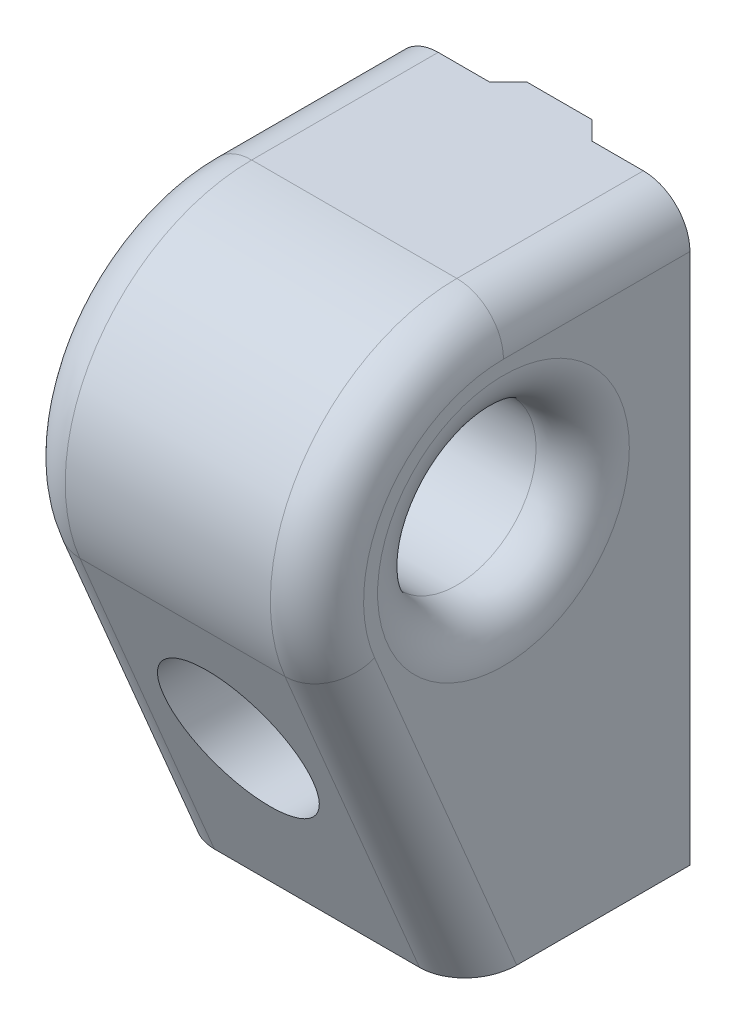
ISO-10303-21;
HEADER;
FILE_DESCRIPTION(('STEP AP214'),'2;1');
FILE_NAME('part.step','',(''),(''),'','','');
FILE_SCHEMA(('AUTOMOTIVE_DESIGN { 1 0 10303 214 1 1 1 1 }'));
ENDSEC;
DATA;
#1=APPLICATION_CONTEXT('core data for automotive mechanical design processes');
#2=APPLICATION_PROTOCOL_DEFINITION('international standard','automotive_design',2000,#1);
#3=PRODUCT_CONTEXT('',#1,'mechanical');
#4=PRODUCT('Part','Part','',(#3));
#5=PRODUCT_RELATED_PRODUCT_CATEGORY('part','',(#4));
#6=PRODUCT_DEFINITION_FORMATION('','',#4);
#7=PRODUCT_DEFINITION_CONTEXT('part definition',#1,'design');
#8=PRODUCT_DEFINITION('design','',#6,#7);
#9=PRODUCT_DEFINITION_SHAPE('','',#8);
#10=(LENGTH_UNIT() NAMED_UNIT(*) SI_UNIT(.MILLI.,.METRE.));
#11=(NAMED_UNIT(*) PLANE_ANGLE_UNIT() SI_UNIT($,.RADIAN.));
#12=(NAMED_UNIT(*) SI_UNIT($,.STERADIAN.) SOLID_ANGLE_UNIT());
#13=UNCERTAINTY_MEASURE_WITH_UNIT(LENGTH_MEASURE(1.E-05),#10,'distance_accuracy_value','');
#14=(GEOMETRIC_REPRESENTATION_CONTEXT(3) GLOBAL_UNCERTAINTY_ASSIGNED_CONTEXT((#13)) GLOBAL_UNIT_ASSIGNED_CONTEXT((#10,
#11,#12)) REPRESENTATION_CONTEXT('',''));
#15=CARTESIAN_POINT('',(0.,0.,0.));
#16=DIRECTION('',(0.,0.,1.));
#17=DIRECTION('',(1.,0.,0.));
#18=AXIS2_PLACEMENT_3D('',#15,#16,#17);
#19=CARTESIAN_POINT('',(0.,0.,-1.));
#20=DIRECTION('',(0.,0.,-1.));
#21=DIRECTION('',(-1.,0.,0.));
#22=AXIS2_PLACEMENT_3D('',#19,#20,#21);
#23=PLANE('',#22);
#24=CARTESIAN_POINT('',(0.,10.,-1.));
#25=DIRECTION('',(0.,0.,-1.));
#26=DIRECTION('',(-1.,0.,0.));
#27=AXIS2_PLACEMENT_3D('',#24,#25,#26);
#28=CIRCLE('',#27,2.1);
#29=CARTESIAN_POINT('',(-1.75,11.1608186766244,-1.));
#30=VERTEX_POINT('',#29);
#31=CARTESIAN_POINT('',(1.75,11.1608186766244,-1.));
#32=VERTEX_POINT('',#31);
#33=EDGE_CURVE('E143',#30,#32,#28,.T.);
#34=ORIENTED_EDGE('',*,*,#33,.F.);
#35=DIRECTION('',(0.,1.,0.));
#36=VECTOR('',#35,1.);
#37=CARTESIAN_POINT('',(-1.75,31.,-1.));
#38=LINE('',#37,#36);
#39=CARTESIAN_POINT('',(-1.75,31.,-1.));
#40=VERTEX_POINT('',#39);
#41=EDGE_CURVE('E156',#30,#40,#38,.T.);
#42=ORIENTED_EDGE('',*,*,#41,.T.);
#43=DIRECTION('',(1.,0.,0.));
#44=VECTOR('',#43,1.);
#45=CARTESIAN_POINT('',(2.75,31.,-1.));
#46=LINE('',#45,#44);
#47=CARTESIAN_POINT('',(1.75,31.,-1.));
#48=VERTEX_POINT('',#47);
#49=EDGE_CURVE('E269',#40,#48,#46,.T.);
#50=ORIENTED_EDGE('',*,*,#49,.T.);
#51=DIRECTION('',(0.,-1.,0.));
#52=VECTOR('',#51,1.);
#53=CARTESIAN_POINT('',(1.75,0.,-1.));
#54=LINE('',#53,#52);
#55=EDGE_CURVE('E159',#48,#32,#54,.T.);
#56=ORIENTED_EDGE('',*,*,#55,.T.);
#57=EDGE_LOOP('',(#34,#42,#50,#56));
#58=FACE_BOUND('',#57,.T.);
#59=ADVANCED_FACE('F32',(#58),#23,.T.);
#60=CARTESIAN_POINT('',(8.,0.,0.));
#61=DIRECTION('',(0.,0.,1.));
#62=DIRECTION('',(1.,0.,0.));
#63=AXIS2_PLACEMENT_3D('',#60,#61,#62);
#64=PLANE('',#63);
#65=DIRECTION('',(-1.,0.,0.));
#66=VECTOR('',#65,1.);
#67=CARTESIAN_POINT('',(8.,31.,0.));
#68=LINE('',#67,#66);
#69=CARTESIAN_POINT('',(5.5,31.,0.));
#70=VERTEX_POINT('',#69);
#71=CARTESIAN_POINT('',(2.75,31.,0.));
#72=VERTEX_POINT('',#71);
#73=EDGE_CURVE('E278',#70,#72,#68,.T.);
#74=ORIENTED_EDGE('',*,*,#73,.F.);
#75=CARTESIAN_POINT('',(5.5,28.5,0.));
#76=DIRECTION('',(0.,0.,1.));
#77=DIRECTION('',(1.,0.,0.));
#78=AXIS2_PLACEMENT_3D('',#75,#76,#77);
#79=CIRCLE('',#78,2.5);
#80=CARTESIAN_POINT('',(8.,28.5,0.));
#81=VERTEX_POINT('',#80);
#82=EDGE_CURVE('E217',#70,#81,#79,.F.);
#83=ORIENTED_EDGE('',*,*,#82,.T.);
#84=DIRECTION('',(0.,1.,0.));
#85=VECTOR('',#84,1.);
#86=CARTESIAN_POINT('',(8.,0.,0.));
#87=LINE('',#86,#85);
#88=CARTESIAN_POINT('',(8.,0.,0.));
#89=VERTEX_POINT('',#88);
#90=EDGE_CURVE('E257',#89,#81,#87,.T.);
#91=ORIENTED_EDGE('',*,*,#90,.F.);
#92=DIRECTION('',(-1.,0.,0.));
#93=VECTOR('',#92,1.);
#94=CARTESIAN_POINT('',(8.,0.,0.));
#95=LINE('',#94,#93);
#96=CARTESIAN_POINT('',(2.75,0.,0.));
#97=VERTEX_POINT('',#96);
#98=EDGE_CURVE('E256',#89,#97,#95,.T.);
#99=ORIENTED_EDGE('',*,*,#98,.T.);
#100=DIRECTION('',(0.,-1.,0.));
#101=VECTOR('',#100,1.);
#102=CARTESIAN_POINT('',(2.75,31.,0.));
#103=LINE('',#102,#101);
#104=EDGE_CURVE('E151',#72,#97,#103,.T.);
#105=ORIENTED_EDGE('',*,*,#104,.F.);
#106=EDGE_LOOP('',(#74,#83,#91,#99,#105));
#107=FACE_BOUND('',#106,.T.);
#108=ADVANCED_FACE('F329',(#107),#64,.F.);
#109=DIRECTION('',(0.,1.,0.));
#110=VECTOR('',#109,1.);
#111=CARTESIAN_POINT('',(-8.,0.,0.));
#112=LINE('',#111,#110);
#113=CARTESIAN_POINT('',(-8.,0.,0.));
#114=VERTEX_POINT('',#113);
#115=CARTESIAN_POINT('',(-8.,28.5,0.));
#116=VERTEX_POINT('',#115);
#117=EDGE_CURVE('E258',#114,#116,#112,.T.);
#118=ORIENTED_EDGE('',*,*,#117,.T.);
#119=CARTESIAN_POINT('',(-5.5,28.5,0.));
#120=DIRECTION('',(0.,0.,1.));
#121=DIRECTION('',(1.,0.,0.));
#122=AXIS2_PLACEMENT_3D('',#119,#120,#121);
#123=CIRCLE('',#122,2.5);
#124=CARTESIAN_POINT('',(-5.5,31.,0.));
#125=VERTEX_POINT('',#124);
#126=EDGE_CURVE('E201',#116,#125,#123,.F.);
#127=ORIENTED_EDGE('',*,*,#126,.T.);
#128=CARTESIAN_POINT('',(-2.75,31.,0.));
#129=VERTEX_POINT('',#128);
#130=EDGE_CURVE('E277',#129,#125,#68,.T.);
#131=ORIENTED_EDGE('',*,*,#130,.F.);
#132=DIRECTION('',(0.,1.,0.));
#133=VECTOR('',#132,1.);
#134=CARTESIAN_POINT('',(-2.75,31.,0.));
#135=LINE('',#134,#133);
#136=CARTESIAN_POINT('',(-2.75,0.,0.));
#137=VERTEX_POINT('',#136);
#138=EDGE_CURVE('E266',#137,#129,#135,.T.);
#139=ORIENTED_EDGE('',*,*,#138,.F.);
#140=EDGE_CURVE('E279',#137,#114,#95,.T.);
#141=ORIENTED_EDGE('',*,*,#140,.T.);
#142=EDGE_LOOP('',(#118,#127,#131,#139,#141));
#143=FACE_BOUND('',#142,.T.);
#144=ADVANCED_FACE('F287',(#143),#64,.F.);
#145=CARTESIAN_POINT('',(8.,21.,10.));
#146=DIRECTION('',(1.,0.,0.));
#147=DIRECTION('',(0.,0.,-1.));
#148=AXIS2_PLACEMENT_3D('',#145,#146,#147);
#149=PLANE('',#148);
#150=CARTESIAN_POINT('',(8.,21.,10.));
#151=DIRECTION('',(1.,0.,0.));
#152=DIRECTION('',(0.,0.,-1.));
#153=AXIS2_PLACEMENT_3D('',#150,#151,#152);
#154=CIRCLE('',#153,6.75);
#155=CARTESIAN_POINT('',(8.,21.,3.25));
#156=VERTEX_POINT('',#155);
#157=EDGE_CURVE('E214',#156,#156,#154,.F.);
#158=ORIENTED_EDGE('',*,*,#157,.T.);
#159=EDGE_LOOP('',(#158));
#160=FACE_BOUND('',#159,.T.);
#161=ORIENTED_EDGE('',*,*,#90,.T.);
#162=DIRECTION('',(0.,0.,1.));
#163=VECTOR('',#162,1.);
#164=CARTESIAN_POINT('',(8.,28.5,10.));
#165=LINE('',#164,#163);
#166=CARTESIAN_POINT('',(8.,28.5,10.));
#167=VERTEX_POINT('',#166);
#168=EDGE_CURVE('E211',#81,#167,#165,.T.);
#169=ORIENTED_EDGE('',*,*,#168,.T.);
#170=CARTESIAN_POINT('',(8.,21.,10.));
#171=DIRECTION('',(1.,0.,0.));
#172=DIRECTION('',(0.,0.,-1.));
#173=AXIS2_PLACEMENT_3D('',#170,#171,#172);
#174=CIRCLE('',#173,7.5);
#175=CARTESIAN_POINT('',(8.,18.086769964753,16.9110846299069));
#176=VERTEX_POINT('',#175);
#177=EDGE_CURVE('E209',#167,#176,#174,.T.);
#178=ORIENTED_EDGE('',*,*,#177,.T.);
#179=DIRECTION('',(0.,-0.921477950654249,-0.388430671366262));
#180=VECTOR('',#179,1.);
#181=CARTESIAN_POINT('',(8.,0.971076678415651,9.69630512336438));
#182=LINE('',#181,#180);
#183=CARTESIAN_POINT('',(8.,0.,9.28696709647257));
#184=VERTEX_POINT('',#183);
#185=EDGE_CURVE('E207',#176,#184,#182,.T.);
#186=ORIENTED_EDGE('',*,*,#185,.T.);
#187=DIRECTION('',(0.,0.,-1.));
#188=VECTOR('',#187,1.);
#189=CARTESIAN_POINT('',(8.,0.,12.));
#190=LINE('',#189,#188);
#191=EDGE_CURVE('E251',#184,#89,#190,.T.);
#192=ORIENTED_EDGE('',*,*,#191,.T.);
#193=EDGE_LOOP('',(#161,#169,#178,#186,#192));
#194=FACE_BOUND('',#193,.T.);
#195=ADVANCED_FACE('F250',(#160,#194),#149,.T.);
#196=CARTESIAN_POINT('',(-8.,21.,10.));
#197=DIRECTION('',(1.,0.,0.));
#198=DIRECTION('',(0.,0.,-1.));
#199=AXIS2_PLACEMENT_3D('',#196,#197,#198);
#200=PLANE('',#199);
#201=CARTESIAN_POINT('',(-8.,21.,10.));
#202=DIRECTION('',(1.,0.,0.));
#203=DIRECTION('',(0.,0.,-1.));
#204=AXIS2_PLACEMENT_3D('',#201,#202,#203);
#205=CIRCLE('',#204,6.75);
#206=CARTESIAN_POINT('',(-8.,21.,3.25));
#207=VERTEX_POINT('',#206);
#208=EDGE_CURVE('E198',#207,#207,#205,.T.);
#209=ORIENTED_EDGE('',*,*,#208,.T.);
#210=EDGE_LOOP('',(#209));
#211=FACE_BOUND('',#210,.T.);
#212=CARTESIAN_POINT('',(-8.,21.,10.));
#213=DIRECTION('',(1.,0.,0.));
#214=DIRECTION('',(0.,0.,-1.));
#215=AXIS2_PLACEMENT_3D('',#212,#213,#214);
#216=CIRCLE('',#215,7.5);
#217=CARTESIAN_POINT('',(-8.,18.086769964753,16.9110846299069));
#218=VERTEX_POINT('',#217);
#219=CARTESIAN_POINT('',(-8.,28.5,10.));
#220=VERTEX_POINT('',#219);
#221=EDGE_CURVE('E194',#218,#220,#216,.F.);
#222=ORIENTED_EDGE('',*,*,#221,.T.);
#223=DIRECTION('',(0.,0.,1.));
#224=VECTOR('',#223,1.);
#225=CARTESIAN_POINT('',(-8.,28.5,10.));
#226=LINE('',#225,#224);
#227=EDGE_CURVE('E196',#220,#116,#226,.F.);
#228=ORIENTED_EDGE('',*,*,#227,.T.);
#229=ORIENTED_EDGE('',*,*,#117,.F.);
#230=DIRECTION('',(0.,0.,-1.));
#231=VECTOR('',#230,1.);
#232=CARTESIAN_POINT('',(-8.,0.,12.));
#233=LINE('',#232,#231);
#234=CARTESIAN_POINT('',(-8.,0.,9.28696709647257));
#235=VERTEX_POINT('',#234);
#236=EDGE_CURVE('E263',#235,#114,#233,.T.);
#237=ORIENTED_EDGE('',*,*,#236,.F.);
#238=DIRECTION('',(0.,-0.921477950654249,-0.388430671366262));
#239=VECTOR('',#238,1.);
#240=CARTESIAN_POINT('',(-8.,18.086769964753,16.9110846299069));
#241=LINE('',#240,#239);
#242=EDGE_CURVE('E192',#235,#218,#241,.F.);
#243=ORIENTED_EDGE('',*,*,#242,.T.);
#244=EDGE_LOOP('',(#222,#228,#229,#237,#243));
#245=FACE_BOUND('',#244,.T.);
#246=ADVANCED_FACE('F293',(#211,#245),#200,.F.);
#247=CARTESIAN_POINT('',(8.,0.,12.));
#248=DIRECTION('',(0.,1.,0.));
#249=DIRECTION('',(0.,0.,1.));
#250=AXIS2_PLACEMENT_3D('',#247,#248,#249);
#251=PLANE('',#250);
#252=DIRECTION('',(-1.,0.,0.));
#253=VECTOR('',#252,1.);
#254=CARTESIAN_POINT('',(8.,0.,12.));
#255=LINE('',#254,#253);
#256=CARTESIAN_POINT('',(5.5,0.,12.));
#257=VERTEX_POINT('',#256);
#258=CARTESIAN_POINT('',(-5.5,0.,12.));
#259=VERTEX_POINT('',#258);
#260=EDGE_CURVE('E260',#257,#259,#255,.T.);
#261=ORIENTED_EDGE('',*,*,#260,.T.);
#262=CARTESIAN_POINT('',(-5.5,0.,9.28696709647257));
#263=DIRECTION('',(0.,1.,0.));
#264=DIRECTION('',(0.,0.,-1.));
#265=AXIS2_PLACEMENT_3D('',#262,#263,#264);
#266=ELLIPSE('',#265,2.71303290352743,2.5);
#267=EDGE_CURVE('E11',#259,#235,#266,.F.);
#268=ORIENTED_EDGE('',*,*,#267,.T.);
#269=ORIENTED_EDGE('',*,*,#236,.T.);
#270=ORIENTED_EDGE('',*,*,#140,.F.);
#271=DIRECTION('',(0.707106781186546,0.,-0.707106781186549));
#272=VECTOR('',#271,1.);
#273=CARTESIAN_POINT('',(-1.75,0.,-1.));
#274=LINE('',#273,#272);
#275=CARTESIAN_POINT('',(-1.75,0.,-1.));
#276=VERTEX_POINT('',#275);
#277=EDGE_CURVE('E176',#137,#276,#274,.T.);
#278=ORIENTED_EDGE('',*,*,#277,.T.);
#279=DIRECTION('',(-1.,0.,0.));
#280=VECTOR('',#279,1.);
#281=CARTESIAN_POINT('',(2.75,0.,-1.));
#282=LINE('',#281,#280);
#283=CARTESIAN_POINT('',(1.75,0.,-1.));
#284=VERTEX_POINT('',#283);
#285=EDGE_CURVE('E354',#284,#276,#282,.T.);
#286=ORIENTED_EDGE('',*,*,#285,.F.);
#287=DIRECTION('',(0.707106781186546,0.,0.707106781186549));
#288=VECTOR('',#287,1.);
#289=CARTESIAN_POINT('',(1.75,0.,-1.));
#290=LINE('',#289,#288);
#291=EDGE_CURVE('E174',#284,#97,#290,.T.);
#292=ORIENTED_EDGE('',*,*,#291,.T.);
#293=ORIENTED_EDGE('',*,*,#98,.F.);
#294=ORIENTED_EDGE('',*,*,#191,.F.);
#295=CARTESIAN_POINT('',(5.5,0.,9.28696709647257));
#296=DIRECTION('',(0.,1.,0.));
#297=DIRECTION('',(0.,0.,1.));
#298=AXIS2_PLACEMENT_3D('',#295,#296,#297);
#299=ELLIPSE('',#298,2.71303290352743,2.5);
#300=EDGE_CURVE('E41',#184,#257,#299,.F.);
#301=ORIENTED_EDGE('',*,*,#300,.T.);
#302=EDGE_LOOP('',(#261,#268,#269,#270,#278,#286,#292,#293,#294,#301));
#303=FACE_BOUND('',#302,.T.);
#304=ADVANCED_FACE('F254',(#303),#251,.F.);
#305=CARTESIAN_POINT('',(8.,31.,0.));
#306=DIRECTION('',(0.,-1.,0.));
#307=DIRECTION('',(0.,0.,-1.));
#308=AXIS2_PLACEMENT_3D('',#305,#306,#307);
#309=PLANE('',#308);
#310=ORIENTED_EDGE('',*,*,#130,.T.);
#311=DIRECTION('',(0.,0.,1.));
#312=VECTOR('',#311,1.);
#313=CARTESIAN_POINT('',(-5.5,31.,0.));
#314=LINE('',#313,#312);
#315=CARTESIAN_POINT('',(-5.5,31.,10.));
#316=VERTEX_POINT('',#315);
#317=EDGE_CURVE('E189',#125,#316,#314,.T.);
#318=ORIENTED_EDGE('',*,*,#317,.T.);
#319=DIRECTION('',(-1.,0.,0.));
#320=VECTOR('',#319,1.);
#321=CARTESIAN_POINT('',(8.,31.,10.));
#322=LINE('',#321,#320);
#323=CARTESIAN_POINT('',(5.5,31.,10.));
#324=VERTEX_POINT('',#323);
#325=EDGE_CURVE('E274',#324,#316,#322,.T.);
#326=ORIENTED_EDGE('',*,*,#325,.F.);
#327=DIRECTION('',(0.,0.,1.));
#328=VECTOR('',#327,1.);
#329=CARTESIAN_POINT('',(5.5,31.,0.));
#330=LINE('',#329,#328);
#331=EDGE_CURVE('E180',#324,#70,#330,.F.);
#332=ORIENTED_EDGE('',*,*,#331,.T.);
#333=ORIENTED_EDGE('',*,*,#73,.T.);
#334=DIRECTION('',(-0.707106781186546,0.,-0.707106781186549));
#335=VECTOR('',#334,1.);
#336=CARTESIAN_POINT('',(1.75,31.,-0.999999999999997));
#337=LINE('',#336,#335);
#338=EDGE_CURVE('E167',#72,#48,#337,.T.);
#339=ORIENTED_EDGE('',*,*,#338,.T.);
#340=ORIENTED_EDGE('',*,*,#49,.F.);
#341=DIRECTION('',(-0.707106781186546,0.,0.707106781186549));
#342=VECTOR('',#341,1.);
#343=CARTESIAN_POINT('',(-1.75,31.,-0.999999999999997));
#344=LINE('',#343,#342);
#345=EDGE_CURVE('E163',#40,#129,#344,.T.);
#346=ORIENTED_EDGE('',*,*,#345,.T.);
#347=EDGE_LOOP('',(#310,#318,#326,#332,#333,#339,#340,#346));
#348=FACE_BOUND('',#347,.T.);
#349=ADVANCED_FACE('F310',(#348),#309,.F.);
#350=CARTESIAN_POINT('',(8.,21.,10.));
#351=DIRECTION('',(-1.,0.,0.));
#352=DIRECTION('',(0.,0.,1.));
#353=AXIS2_PLACEMENT_3D('',#350,#351,#352);
#354=CYLINDRICAL_SURFACE('',#353,10.);
#355=ORIENTED_EDGE('',*,*,#325,.T.);
#356=CARTESIAN_POINT('',(-5.5,21.,10.));
#357=DIRECTION('',(1.,0.,0.));
#358=DIRECTION('',(0.,0.,-1.));
#359=AXIS2_PLACEMENT_3D('',#356,#357,#358);
#360=CIRCLE('',#359,10.);
#361=CARTESIAN_POINT('',(-5.5,17.1156932863374,19.2147795065425));
#362=VERTEX_POINT('',#361);
#363=EDGE_CURVE('E205',#316,#362,#360,.T.);
#364=ORIENTED_EDGE('',*,*,#363,.T.);
#365=DIRECTION('',(-1.,0.,0.));
#366=VECTOR('',#365,1.);
#367=CARTESIAN_POINT('',(8.,17.1156932863374,19.2147795065425));
#368=LINE('',#367,#366);
#369=CARTESIAN_POINT('',(5.5,17.1156932863374,19.2147795065425));
#370=VERTEX_POINT('',#369);
#371=EDGE_CURVE('E272',#370,#362,#368,.T.);
#372=ORIENTED_EDGE('',*,*,#371,.F.);
#373=CARTESIAN_POINT('',(5.5,21.,10.));
#374=DIRECTION('',(1.,0.,0.));
#375=DIRECTION('',(0.,0.,-1.));
#376=AXIS2_PLACEMENT_3D('',#373,#374,#375);
#377=CIRCLE('',#376,10.);
#378=EDGE_CURVE('E203',#370,#324,#377,.F.);
#379=ORIENTED_EDGE('',*,*,#378,.T.);
#380=EDGE_LOOP('',(#355,#364,#372,#379));
#381=FACE_BOUND('',#380,.T.);
#382=ADVANCED_FACE('F311',(#381),#354,.T.);
#383=CARTESIAN_POINT('',(8.,17.1156932863374,19.2147795065425));
#384=DIRECTION('',(0.,0.388430671366262,-0.921477950654249));
#385=DIRECTION('',(0.,0.921477950654249,0.388430671366262));
#386=AXIS2_PLACEMENT_3D('',#383,#384,#385);
#387=PLANE('',#386);
#388=CARTESIAN_POINT('',(0.,10.,16.2153007686237));
#389=DIRECTION('',(0.,0.388430671366262,-0.921477950654249));
#390=DIRECTION('',(0.,-0.921477950654249,-0.388430671366262));
#391=AXIS2_PLACEMENT_3D('',#388,#389,#390);
#392=ELLIPSE('',#391,4.34085264564388,4.);
#393=CARTESIAN_POINT('',(0.,6.,14.5291804611742));
#394=VERTEX_POINT('',#393);
#395=EDGE_CURVE('E184',#394,#394,#392,.T.);
#396=ORIENTED_EDGE('',*,*,#395,.T.);
#397=EDGE_LOOP('',(#396));
#398=FACE_BOUND('',#397,.T.);
#399=ORIENTED_EDGE('',*,*,#371,.T.);
#400=DIRECTION('',(0.,-0.921477950654249,-0.388430671366262));
#401=VECTOR('',#400,1.);
#402=CARTESIAN_POINT('',(-5.5,17.1156932863374,19.2147795065425));
#403=LINE('',#402,#401);
#404=EDGE_CURVE('E49',#362,#259,#403,.T.);
#405=ORIENTED_EDGE('',*,*,#404,.T.);
#406=ORIENTED_EDGE('',*,*,#260,.F.);
#407=DIRECTION('',(0.,-0.921477950654249,-0.388430671366262));
#408=VECTOR('',#407,1.);
#409=CARTESIAN_POINT('',(5.5,17.1156932863374,19.2147795065425));
#410=LINE('',#409,#408);
#411=EDGE_CURVE('E225',#257,#370,#410,.F.);
#412=ORIENTED_EDGE('',*,*,#411,.T.);
#413=EDGE_LOOP('',(#399,#405,#406,#412));
#414=FACE_BOUND('',#413,.T.);
#415=ADVANCED_FACE('F312',(#398,#414),#387,.F.);
#416=CARTESIAN_POINT('',(8.,21.,10.));
#417=DIRECTION('',(-1.,0.,0.));
#418=DIRECTION('',(0.,0.,1.));
#419=AXIS2_PLACEMENT_3D('',#416,#417,#418);
#420=CYLINDRICAL_SURFACE('',#419,4.25);
#421=CARTESIAN_POINT('',(-5.5,21.,10.));
#422=DIRECTION('',(1.,0.,0.));
#423=DIRECTION('',(0.,0.,-1.));
#424=AXIS2_PLACEMENT_3D('',#421,#422,#423);
#425=CIRCLE('',#424,4.25);
#426=CARTESIAN_POINT('',(-5.5,21.,5.75));
#427=VERTEX_POINT('',#426);
#428=EDGE_CURVE('E222',#427,#427,#425,.F.);
#429=ORIENTED_EDGE('',*,*,#428,.T.);
#430=EDGE_LOOP('',(#429));
#431=FACE_BOUND('',#430,.T.);
#432=CARTESIAN_POINT('',(5.5,21.,10.));
#433=DIRECTION('',(1.,0.,0.));
#434=DIRECTION('',(0.,0.,-1.));
#435=AXIS2_PLACEMENT_3D('',#432,#433,#434);
#436=CIRCLE('',#435,4.25);
#437=CARTESIAN_POINT('',(5.5,21.,5.75));
#438=VERTEX_POINT('',#437);
#439=EDGE_CURVE('E219',#438,#438,#436,.T.);
#440=ORIENTED_EDGE('',*,*,#439,.T.);
#441=EDGE_LOOP('',(#440));
#442=FACE_BOUND('',#441,.T.);
#443=ADVANCED_FACE('F339',(#431,#442),#420,.F.);
#444=CARTESIAN_POINT('',(1.75,8.83918132337561,-1.));
#445=VERTEX_POINT('',#444);
#446=CARTESIAN_POINT('',(-1.75,8.83918132337561,-1.));
#447=VERTEX_POINT('',#446);
#448=EDGE_CURVE('E146',#445,#447,#28,.T.);
#449=ORIENTED_EDGE('',*,*,#448,.F.);
#450=EDGE_CURVE('E168',#445,#284,#54,.T.);
#451=ORIENTED_EDGE('',*,*,#450,.T.);
#452=ORIENTED_EDGE('',*,*,#285,.T.);
#453=EDGE_CURVE('E165',#276,#447,#38,.T.);
#454=ORIENTED_EDGE('',*,*,#453,.T.);
#455=EDGE_LOOP('',(#449,#451,#452,#454));
#456=FACE_BOUND('',#455,.T.);
#457=ADVANCED_FACE('F331',(#456),#23,.T.);
#458=CARTESIAN_POINT('',(-1.75,0.,-1.));
#459=DIRECTION('',(-0.707106781186549,0.,-0.707106781186546));
#460=DIRECTION('',(0.,-1.,0.));
#461=AXIS2_PLACEMENT_3D('',#458,#459,#460);
#462=PLANE('',#461);
#463=CARTESIAN_POINT('',(0.,10.,-2.75));
#464=DIRECTION('',(-0.707106781186549,0.,-0.707106781186546));
#465=DIRECTION('',(0.707106781186546,0.,-0.707106781186549));
#466=AXIS2_PLACEMENT_3D('',#463,#464,#465);
#467=ELLIPSE('',#466,2.9698484809835,2.1);
#468=EDGE_CURVE('E140',#447,#30,#467,.T.);
#469=ORIENTED_EDGE('',*,*,#468,.F.);
#470=ORIENTED_EDGE('',*,*,#453,.F.);
#471=ORIENTED_EDGE('',*,*,#277,.F.);
#472=ORIENTED_EDGE('',*,*,#138,.T.);
#473=ORIENTED_EDGE('',*,*,#345,.F.);
#474=ORIENTED_EDGE('',*,*,#41,.F.);
#475=EDGE_LOOP('',(#469,#470,#471,#472,#473,#474));
#476=FACE_BOUND('',#475,.T.);
#477=ADVANCED_FACE('F161',(#476),#462,.T.);
#478=CARTESIAN_POINT('',(1.75,0.,-1.));
#479=DIRECTION('',(0.707106781186549,0.,-0.707106781186546));
#480=DIRECTION('',(0.,1.,0.));
#481=AXIS2_PLACEMENT_3D('',#478,#479,#480);
#482=PLANE('',#481);
#483=CARTESIAN_POINT('',(0.,10.,-2.75));
#484=DIRECTION('',(0.707106781186549,0.,-0.707106781186546));
#485=DIRECTION('',(-0.707106781186546,0.,-0.707106781186549));
#486=AXIS2_PLACEMENT_3D('',#483,#484,#485);
#487=ELLIPSE('',#486,2.9698484809835,2.1);
#488=EDGE_CURVE('E178',#32,#445,#487,.T.);
#489=ORIENTED_EDGE('',*,*,#488,.F.);
#490=ORIENTED_EDGE('',*,*,#55,.F.);
#491=ORIENTED_EDGE('',*,*,#338,.F.);
#492=ORIENTED_EDGE('',*,*,#104,.T.);
#493=ORIENTED_EDGE('',*,*,#291,.F.);
#494=ORIENTED_EDGE('',*,*,#450,.F.);
#495=EDGE_LOOP('',(#489,#490,#491,#492,#493,#494));
#496=FACE_BOUND('',#495,.T.);
#497=ADVANCED_FACE('F345',(#496),#482,.T.);
#498=CARTESIAN_POINT('',(0.,10.,20.));
#499=DIRECTION('',(0.,0.,-1.));
#500=DIRECTION('',(-1.,0.,0.));
#501=AXIS2_PLACEMENT_3D('',#498,#499,#500);
#502=CYLINDRICAL_SURFACE('',#501,2.1);
#503=CARTESIAN_POINT('',(0.,10.,5.));
#504=DIRECTION('',(0.,0.,-1.));
#505=DIRECTION('',(-1.,0.,0.));
#506=AXIS2_PLACEMENT_3D('',#503,#504,#505);
#507=CIRCLE('',#506,2.1);
#508=CARTESIAN_POINT('',(-2.1,10.,5.));
#509=VERTEX_POINT('',#508);
#510=EDGE_CURVE('E181',#509,#509,#507,.F.);
#511=ORIENTED_EDGE('',*,*,#510,.T.);
#512=EDGE_LOOP('',(#511));
#513=FACE_BOUND('',#512,.T.);
#514=ORIENTED_EDGE('',*,*,#468,.T.);
#515=ORIENTED_EDGE('',*,*,#33,.T.);
#516=ORIENTED_EDGE('',*,*,#488,.T.);
#517=ORIENTED_EDGE('',*,*,#448,.T.);
#518=EDGE_LOOP('',(#514,#515,#516,#517));
#519=FACE_BOUND('',#518,.T.);
#520=ADVANCED_FACE('F142',(#513,#519),#502,.F.);
#521=CARTESIAN_POINT('',(0.,10.,20.));
#522=DIRECTION('',(0.,0.,-1.));
#523=DIRECTION('',(-1.,0.,0.));
#524=AXIS2_PLACEMENT_3D('',#521,#522,#523);
#525=CYLINDRICAL_SURFACE('',#524,4.);
#526=CARTESIAN_POINT('',(0.,10.,5.));
#527=DIRECTION('',(0.,0.,-1.));
#528=DIRECTION('',(-1.,0.,0.));
#529=AXIS2_PLACEMENT_3D('',#526,#527,#528);
#530=CIRCLE('',#529,4.);
#531=CARTESIAN_POINT('',(-4.,10.,5.));
#532=VERTEX_POINT('',#531);
#533=EDGE_CURVE('E185',#532,#532,#530,.T.);
#534=ORIENTED_EDGE('',*,*,#533,.T.);
#535=EDGE_LOOP('',(#534));
#536=FACE_BOUND('',#535,.T.);
#537=ORIENTED_EDGE('',*,*,#395,.F.);
#538=EDGE_LOOP('',(#537));
#539=FACE_BOUND('',#538,.T.);
#540=ADVANCED_FACE('F324',(#536,#539),#525,.F.);
#541=CARTESIAN_POINT('',(0.,10.,5.));
#542=DIRECTION('',(0.,0.,-1.));
#543=DIRECTION('',(-1.,0.,0.));
#544=AXIS2_PLACEMENT_3D('',#541,#542,#543);
#545=PLANE('',#544);
#546=ORIENTED_EDGE('',*,*,#533,.F.);
#547=EDGE_LOOP('',(#546));
#548=FACE_BOUND('',#547,.T.);
#549=ORIENTED_EDGE('',*,*,#510,.F.);
#550=EDGE_LOOP('',(#549));
#551=FACE_BOUND('',#550,.T.);
#552=ADVANCED_FACE('F317',(#548,#551),#545,.F.);
#553=CARTESIAN_POINT('',(-5.5,18.086769964753,16.9110846299069));
#554=DIRECTION('',(0.,-0.921477950654249,-0.388430671366262));
#555=DIRECTION('',(0.,0.388430671366262,-0.921477950654249));
#556=AXIS2_PLACEMENT_3D('',#553,#554,#555);
#557=CYLINDRICAL_SURFACE('',#556,2.5);
#558=ORIENTED_EDGE('',*,*,#267,.F.);
#559=ORIENTED_EDGE('',*,*,#404,.F.);
#560=CARTESIAN_POINT('',(-5.5,18.086769964753,16.9110846299069));
#561=DIRECTION('',(0.,0.921477950654249,0.388430671366262));
#562=DIRECTION('',(0.,-0.388430671366262,0.921477950654249));
#563=AXIS2_PLACEMENT_3D('',#560,#561,#562);
#564=CIRCLE('',#563,2.5);
#565=EDGE_CURVE('E231',#218,#362,#564,.T.);
#566=ORIENTED_EDGE('',*,*,#565,.F.);
#567=ORIENTED_EDGE('',*,*,#242,.F.);
#568=EDGE_LOOP('',(#558,#559,#566,#567));
#569=FACE_BOUND('',#568,.T.);
#570=ADVANCED_FACE('F315',(#569),#557,.T.);
#571=CARTESIAN_POINT('',(-5.5,21.,10.));
#572=DIRECTION('',(1.,0.,0.));
#573=DIRECTION('',(0.,0.,-1.));
#574=AXIS2_PLACEMENT_3D('',#571,#572,#573);
#575=TOROIDAL_SURFACE('',#574,7.5,2.5);
#576=ORIENTED_EDGE('',*,*,#565,.T.);
#577=ORIENTED_EDGE('',*,*,#363,.F.);
#578=CARTESIAN_POINT('',(-5.5,28.5,10.));
#579=DIRECTION('',(0.,0.,-1.));
#580=DIRECTION('',(-1.,0.,0.));
#581=AXIS2_PLACEMENT_3D('',#578,#579,#580);
#582=CIRCLE('',#581,2.5);
#583=EDGE_CURVE('E229',#220,#316,#582,.T.);
#584=ORIENTED_EDGE('',*,*,#583,.F.);
#585=ORIENTED_EDGE('',*,*,#221,.F.);
#586=EDGE_LOOP('',(#576,#577,#584,#585));
#587=FACE_BOUND('',#586,.T.);
#588=ADVANCED_FACE('F303',(#587),#575,.T.);
#589=CARTESIAN_POINT('',(-5.5,28.5,0.));
#590=DIRECTION('',(0.,0.,1.));
#591=DIRECTION('',(0.,-1.,0.));
#592=AXIS2_PLACEMENT_3D('',#589,#590,#591);
#593=CYLINDRICAL_SURFACE('',#592,2.5);
#594=ORIENTED_EDGE('',*,*,#126,.F.);
#595=ORIENTED_EDGE('',*,*,#227,.F.);
#596=ORIENTED_EDGE('',*,*,#583,.T.);
#597=ORIENTED_EDGE('',*,*,#317,.F.);
#598=EDGE_LOOP('',(#594,#595,#596,#597));
#599=FACE_BOUND('',#598,.T.);
#600=ADVANCED_FACE('F299',(#599),#593,.T.);
#601=CARTESIAN_POINT('',(5.5,18.086769964753,16.9110846299069));
#602=DIRECTION('',(0.,0.921477950654249,0.388430671366262));
#603=DIRECTION('',(0.,-0.388430671366262,0.921477950654249));
#604=AXIS2_PLACEMENT_3D('',#601,#602,#603);
#605=CYLINDRICAL_SURFACE('',#604,2.5);
#606=ORIENTED_EDGE('',*,*,#300,.F.);
#607=ORIENTED_EDGE('',*,*,#185,.F.);
#608=CARTESIAN_POINT('',(5.5,18.086769964753,16.9110846299069));
#609=DIRECTION('',(0.,0.921477950654249,0.388430671366262));
#610=DIRECTION('',(0.,-0.388430671366262,0.921477950654249));
#611=AXIS2_PLACEMENT_3D('',#608,#609,#610);
#612=CIRCLE('',#611,2.5);
#613=EDGE_CURVE('E36',#370,#176,#612,.T.);
#614=ORIENTED_EDGE('',*,*,#613,.F.);
#615=ORIENTED_EDGE('',*,*,#411,.F.);
#616=EDGE_LOOP('',(#606,#607,#614,#615));
#617=FACE_BOUND('',#616,.T.);
#618=ADVANCED_FACE('F247',(#617),#605,.T.);
#619=CARTESIAN_POINT('',(5.5,21.,10.));
#620=DIRECTION('',(1.,0.,0.));
#621=DIRECTION('',(0.,0.,-1.));
#622=AXIS2_PLACEMENT_3D('',#619,#620,#621);
#623=TOROIDAL_SURFACE('',#622,7.5,2.5);
#624=ORIENTED_EDGE('',*,*,#613,.T.);
#625=ORIENTED_EDGE('',*,*,#177,.F.);
#626=CARTESIAN_POINT('',(5.5,28.5,10.));
#627=DIRECTION('',(0.,0.,-1.));
#628=DIRECTION('',(-1.,0.,0.));
#629=AXIS2_PLACEMENT_3D('',#626,#627,#628);
#630=CIRCLE('',#629,2.5);
#631=EDGE_CURVE('E233',#324,#167,#630,.T.);
#632=ORIENTED_EDGE('',*,*,#631,.F.);
#633=ORIENTED_EDGE('',*,*,#378,.F.);
#634=EDGE_LOOP('',(#624,#625,#632,#633));
#635=FACE_BOUND('',#634,.T.);
#636=ADVANCED_FACE('F243',(#635),#623,.T.);
#637=CARTESIAN_POINT('',(5.5,28.5,10.));
#638=DIRECTION('',(0.,0.,-1.));
#639=DIRECTION('',(0.,1.,0.));
#640=AXIS2_PLACEMENT_3D('',#637,#638,#639);
#641=CYLINDRICAL_SURFACE('',#640,2.5);
#642=ORIENTED_EDGE('',*,*,#82,.F.);
#643=ORIENTED_EDGE('',*,*,#331,.F.);
#644=ORIENTED_EDGE('',*,*,#631,.T.);
#645=ORIENTED_EDGE('',*,*,#168,.F.);
#646=EDGE_LOOP('',(#642,#643,#644,#645));
#647=FACE_BOUND('',#646,.T.);
#648=ADVANCED_FACE('F384',(#647),#641,.T.);
#649=CARTESIAN_POINT('',(-5.5,21.,10.));
#650=DIRECTION('',(1.,0.,0.));
#651=DIRECTION('',(0.,0.,-1.));
#652=AXIS2_PLACEMENT_3D('',#649,#650,#651);
#653=TOROIDAL_SURFACE('',#652,6.75,2.5);
#654=ORIENTED_EDGE('',*,*,#428,.F.);
#655=EDGE_LOOP('',(#654));
#656=FACE_BOUND('',#655,.T.);
#657=ORIENTED_EDGE('',*,*,#208,.F.);
#658=EDGE_LOOP('',(#657));
#659=FACE_BOUND('',#658,.T.);
#660=ADVANCED_FACE('F386',(#656,#659),#653,.T.);
#661=CARTESIAN_POINT('',(5.5,21.,10.));
#662=DIRECTION('',(1.,0.,0.));
#663=DIRECTION('',(0.,0.,-1.));
#664=AXIS2_PLACEMENT_3D('',#661,#662,#663);
#665=TOROIDAL_SURFACE('',#664,6.75,2.5);
#666=ORIENTED_EDGE('',*,*,#157,.F.);
#667=EDGE_LOOP('',(#666));
#668=FACE_BOUND('',#667,.T.);
#669=ORIENTED_EDGE('',*,*,#439,.F.);
#670=EDGE_LOOP('',(#669));
#671=FACE_BOUND('',#670,.T.);
#672=ADVANCED_FACE('F34',(#668,#671),#665,.T.);
#673=CLOSED_SHELL('',(#59,#108,#144,#195,#246,#304,#349,#382,#415,#443,#457,#477,#497,#520,#540,
#552,#570,#588,#600,#618,#636,#648,#660,#672));
#674=MANIFOLD_SOLID_BREP('B2',#673);
#675=ADVANCED_BREP_SHAPE_REPRESENTATION('',(#18,#674),#14);
#676=SHAPE_DEFINITION_REPRESENTATION(#9,#675);
ENDSEC;
END-ISO-10303-21;
